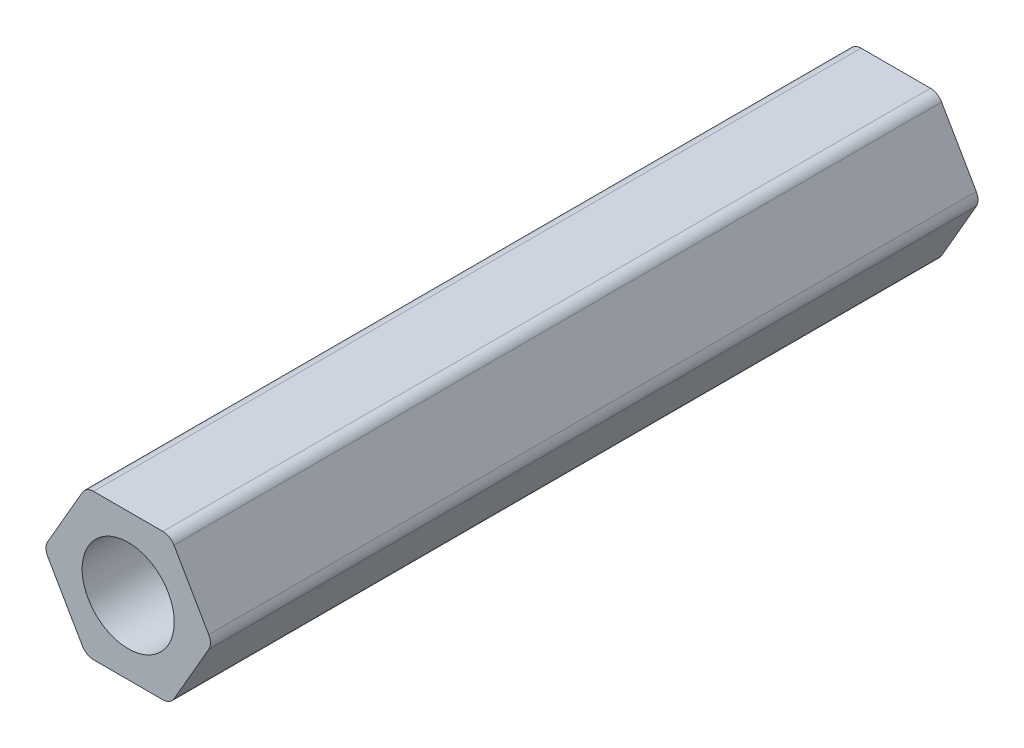
ISO-10303-21;
HEADER;
FILE_DESCRIPTION(('STEP AP214'),'2;1');
FILE_NAME('part.step','',(''),(''),'','','');
FILE_SCHEMA(('AUTOMOTIVE_DESIGN { 1 0 10303 214 1 1 1 1 }'));
ENDSEC;
DATA;
#1=APPLICATION_CONTEXT('core data for automotive mechanical design processes');
#2=APPLICATION_PROTOCOL_DEFINITION('international standard','automotive_design',2000,#1);
#3=PRODUCT_CONTEXT('',#1,'mechanical');
#4=PRODUCT('Part','Part','',(#3));
#5=PRODUCT_RELATED_PRODUCT_CATEGORY('part','',(#4));
#6=PRODUCT_DEFINITION_FORMATION('','',#4);
#7=PRODUCT_DEFINITION_CONTEXT('part definition',#1,'design');
#8=PRODUCT_DEFINITION('design','',#6,#7);
#9=PRODUCT_DEFINITION_SHAPE('','',#8);
#10=(LENGTH_UNIT() NAMED_UNIT(*) SI_UNIT(.MILLI.,.METRE.));
#11=(NAMED_UNIT(*) PLANE_ANGLE_UNIT() SI_UNIT($,.RADIAN.));
#12=(NAMED_UNIT(*) SI_UNIT($,.STERADIAN.) SOLID_ANGLE_UNIT());
#13=UNCERTAINTY_MEASURE_WITH_UNIT(LENGTH_MEASURE(1.E-05),#10,'distance_accuracy_value','');
#14=(GEOMETRIC_REPRESENTATION_CONTEXT(3) GLOBAL_UNCERTAINTY_ASSIGNED_CONTEXT((#13)) GLOBAL_UNIT_ASSIGNED_CONTEXT((#10,
#11,#12)) REPRESENTATION_CONTEXT('',''));
#15=CARTESIAN_POINT('',(0.,0.,0.));
#16=DIRECTION('',(0.,0.,1.));
#17=DIRECTION('',(1.,0.,0.));
#18=AXIS2_PLACEMENT_3D('',#15,#16,#17);
#19=CARTESIAN_POINT('',(-1.35677313259562,-2.35,15.));
#20=DIRECTION('',(0.,0.,1.));
#21=DIRECTION('',(1.,0.,0.));
#22=AXIS2_PLACEMENT_3D('',#19,#20,#21);
#23=CYLINDRICAL_SURFACE('',#22,0.5);
#24=CARTESIAN_POINT('',(-1.35677313259562,-2.35,-15.));
#25=DIRECTION('',(0.,0.,1.));
#26=DIRECTION('',(1.,0.,0.));
#27=AXIS2_PLACEMENT_3D('',#24,#25,#26);
#28=CIRCLE('',#27,0.5);
#29=CARTESIAN_POINT('',(-1.78978583448784,-2.6,-15.));
#30=VERTEX_POINT('',#29);
#31=CARTESIAN_POINT('',(-1.35677313259562,-2.85,-15.));
#32=VERTEX_POINT('',#31);
#33=EDGE_CURVE('E112',#30,#32,#28,.T.);
#34=ORIENTED_EDGE('',*,*,#33,.T.);
#35=DIRECTION('',(0.,0.,1.));
#36=VECTOR('',#35,1.);
#37=CARTESIAN_POINT('',(-1.35677313259562,-2.85,15.));
#38=LINE('',#37,#36);
#39=CARTESIAN_POINT('',(-1.35677313259562,-2.85,15.));
#40=VERTEX_POINT('',#39);
#41=EDGE_CURVE('E110',#32,#40,#38,.T.);
#42=ORIENTED_EDGE('',*,*,#41,.T.);
#43=CARTESIAN_POINT('',(-1.35677313259562,-2.35,15.));
#44=DIRECTION('',(0.,0.,1.));
#45=DIRECTION('',(1.,0.,0.));
#46=AXIS2_PLACEMENT_3D('',#43,#44,#45);
#47=CIRCLE('',#46,0.5);
#48=CARTESIAN_POINT('',(-1.78978583448784,-2.6,15.));
#49=VERTEX_POINT('',#48);
#50=EDGE_CURVE('E19',#40,#49,#47,.F.);
#51=ORIENTED_EDGE('',*,*,#50,.T.);
#52=DIRECTION('',(0.,0.,1.));
#53=VECTOR('',#52,1.);
#54=CARTESIAN_POINT('',(-1.78978583448784,-2.59999999999999,15.));
#55=LINE('',#54,#53);
#56=EDGE_CURVE('E107',#49,#30,#55,.F.);
#57=ORIENTED_EDGE('',*,*,#56,.T.);
#58=EDGE_LOOP('',(#34,#42,#51,#57));
#59=FACE_BOUND('',#58,.T.);
#60=ADVANCED_FACE('F16',(#59),#23,.T.);
#61=CARTESIAN_POINT('',(1.35677313259562,-2.35,15.));
#62=DIRECTION('',(0.,0.,1.));
#63=DIRECTION('',(1.,0.,0.));
#64=AXIS2_PLACEMENT_3D('',#61,#62,#63);
#65=CYLINDRICAL_SURFACE('',#64,0.5);
#66=CARTESIAN_POINT('',(1.35677313259562,-2.35,-15.));
#67=DIRECTION('',(0.,0.,1.));
#68=DIRECTION('',(1.,0.,0.));
#69=AXIS2_PLACEMENT_3D('',#66,#67,#68);
#70=CIRCLE('',#69,0.5);
#71=CARTESIAN_POINT('',(1.35677313259562,-2.85,-15.));
#72=VERTEX_POINT('',#71);
#73=CARTESIAN_POINT('',(1.78978583448784,-2.6,-15.));
#74=VERTEX_POINT('',#73);
#75=EDGE_CURVE('E183',#72,#74,#70,.T.);
#76=ORIENTED_EDGE('',*,*,#75,.T.);
#77=DIRECTION('',(0.,0.,1.));
#78=VECTOR('',#77,1.);
#79=CARTESIAN_POINT('',(1.78978583448784,-2.59999999999999,15.));
#80=LINE('',#79,#78);
#81=CARTESIAN_POINT('',(1.78978583448784,-2.6,15.));
#82=VERTEX_POINT('',#81);
#83=EDGE_CURVE('E155',#74,#82,#80,.T.);
#84=ORIENTED_EDGE('',*,*,#83,.T.);
#85=CARTESIAN_POINT('',(1.35677313259562,-2.35,15.));
#86=DIRECTION('',(0.,0.,1.));
#87=DIRECTION('',(1.,0.,0.));
#88=AXIS2_PLACEMENT_3D('',#85,#86,#87);
#89=CIRCLE('',#88,0.5);
#90=CARTESIAN_POINT('',(1.35677313259562,-2.85,15.));
#91=VERTEX_POINT('',#90);
#92=EDGE_CURVE('E185',#82,#91,#89,.F.);
#93=ORIENTED_EDGE('',*,*,#92,.T.);
#94=DIRECTION('',(0.,0.,1.));
#95=VECTOR('',#94,1.);
#96=CARTESIAN_POINT('',(1.35677313259562,-2.85,15.));
#97=LINE('',#96,#95);
#98=EDGE_CURVE('E162',#91,#72,#97,.F.);
#99=ORIENTED_EDGE('',*,*,#98,.T.);
#100=EDGE_LOOP('',(#76,#84,#93,#99));
#101=FACE_BOUND('',#100,.T.);
#102=ADVANCED_FACE('F354',(#101),#65,.T.);
#103=CARTESIAN_POINT('',(2.71354626519125,0.,15.));
#104=DIRECTION('',(0.,0.,1.));
#105=DIRECTION('',(1.,0.,0.));
#106=AXIS2_PLACEMENT_3D('',#103,#104,#105);
#107=CYLINDRICAL_SURFACE('',#106,0.5);
#108=CARTESIAN_POINT('',(2.71354626519125,0.,-15.));
#109=DIRECTION('',(0.,0.,1.));
#110=DIRECTION('',(1.,0.,0.));
#111=AXIS2_PLACEMENT_3D('',#108,#109,#110);
#112=CIRCLE('',#111,0.5);
#113=CARTESIAN_POINT('',(3.14655896708347,-0.249999999999989,-15.));
#114=VERTEX_POINT('',#113);
#115=CARTESIAN_POINT('',(3.14655896708347,0.25000000000001,-15.));
#116=VERTEX_POINT('',#115);
#117=EDGE_CURVE('E179',#114,#116,#112,.T.);
#118=ORIENTED_EDGE('',*,*,#117,.T.);
#119=DIRECTION('',(0.,0.,1.));
#120=VECTOR('',#119,1.);
#121=CARTESIAN_POINT('',(3.14655896708346,0.250000000000008,15.));
#122=LINE('',#121,#120);
#123=CARTESIAN_POINT('',(3.14655896708347,0.25000000000001,15.));
#124=VERTEX_POINT('',#123);
#125=EDGE_CURVE('E148',#116,#124,#122,.T.);
#126=ORIENTED_EDGE('',*,*,#125,.T.);
#127=CARTESIAN_POINT('',(2.71354626519125,0.,15.));
#128=DIRECTION('',(0.,0.,1.));
#129=DIRECTION('',(1.,0.,0.));
#130=AXIS2_PLACEMENT_3D('',#127,#128,#129);
#131=CIRCLE('',#130,0.5);
#132=CARTESIAN_POINT('',(3.14655896708347,-0.249999999999989,15.));
#133=VERTEX_POINT('',#132);
#134=EDGE_CURVE('E181',#124,#133,#131,.F.);
#135=ORIENTED_EDGE('',*,*,#134,.T.);
#136=DIRECTION('',(0.,0.,1.));
#137=VECTOR('',#136,1.);
#138=CARTESIAN_POINT('',(3.14655896708347,-0.249999999999988,15.));
#139=LINE('',#138,#137);
#140=EDGE_CURVE('E158',#133,#114,#139,.F.);
#141=ORIENTED_EDGE('',*,*,#140,.T.);
#142=EDGE_LOOP('',(#118,#126,#135,#141));
#143=FACE_BOUND('',#142,.T.);
#144=ADVANCED_FACE('F212',(#143),#107,.T.);
#145=CARTESIAN_POINT('',(1.35677313259562,2.35,15.));
#146=DIRECTION('',(0.,0.,1.));
#147=DIRECTION('',(1.,0.,0.));
#148=AXIS2_PLACEMENT_3D('',#145,#146,#147);
#149=CYLINDRICAL_SURFACE('',#148,0.5);
#150=CARTESIAN_POINT('',(1.35677313259562,2.35,-15.));
#151=DIRECTION('',(0.,0.,1.));
#152=DIRECTION('',(1.,0.,0.));
#153=AXIS2_PLACEMENT_3D('',#150,#151,#152);
#154=CIRCLE('',#153,0.5);
#155=CARTESIAN_POINT('',(1.78978583448785,2.6,-15.));
#156=VERTEX_POINT('',#155);
#157=CARTESIAN_POINT('',(1.35677313259562,2.85,-15.));
#158=VERTEX_POINT('',#157);
#159=EDGE_CURVE('E175',#156,#158,#154,.T.);
#160=ORIENTED_EDGE('',*,*,#159,.T.);
#161=DIRECTION('',(0.,0.,1.));
#162=VECTOR('',#161,1.);
#163=CARTESIAN_POINT('',(1.35677313259562,2.85,15.));
#164=LINE('',#163,#162);
#165=CARTESIAN_POINT('',(1.35677313259562,2.85,15.));
#166=VERTEX_POINT('',#165);
#167=EDGE_CURVE('E145',#158,#166,#164,.T.);
#168=ORIENTED_EDGE('',*,*,#167,.T.);
#169=CARTESIAN_POINT('',(1.35677313259562,2.35,15.));
#170=DIRECTION('',(0.,0.,1.));
#171=DIRECTION('',(1.,0.,0.));
#172=AXIS2_PLACEMENT_3D('',#169,#170,#171);
#173=CIRCLE('',#172,0.5);
#174=CARTESIAN_POINT('',(1.78978583448785,2.6,15.));
#175=VERTEX_POINT('',#174);
#176=EDGE_CURVE('E177',#166,#175,#173,.F.);
#177=ORIENTED_EDGE('',*,*,#176,.T.);
#178=DIRECTION('',(0.,0.,1.));
#179=VECTOR('',#178,1.);
#180=CARTESIAN_POINT('',(1.78978583448785,2.6,15.));
#181=LINE('',#180,#179);
#182=EDGE_CURVE('E152',#175,#156,#181,.F.);
#183=ORIENTED_EDGE('',*,*,#182,.T.);
#184=EDGE_LOOP('',(#160,#168,#177,#183));
#185=FACE_BOUND('',#184,.T.);
#186=ADVANCED_FACE('F223',(#185),#149,.T.);
#187=CARTESIAN_POINT('',(-2.71354626519125,0.,15.));
#188=DIRECTION('',(0.,0.,1.));
#189=DIRECTION('',(1.,0.,0.));
#190=AXIS2_PLACEMENT_3D('',#187,#188,#189);
#191=CYLINDRICAL_SURFACE('',#190,0.5);
#192=CARTESIAN_POINT('',(-2.71354626519125,0.,-15.));
#193=DIRECTION('',(0.,0.,1.));
#194=DIRECTION('',(1.,0.,0.));
#195=AXIS2_PLACEMENT_3D('',#192,#193,#194);
#196=CIRCLE('',#195,0.5);
#197=CARTESIAN_POINT('',(-3.14655896708346,0.250000000000007,-15.));
#198=VERTEX_POINT('',#197);
#199=CARTESIAN_POINT('',(-3.14655896708347,-0.249999999999989,-15.));
#200=VERTEX_POINT('',#199);
#201=EDGE_CURVE('E172',#198,#200,#196,.T.);
#202=ORIENTED_EDGE('',*,*,#201,.T.);
#203=DIRECTION('',(0.,0.,1.));
#204=VECTOR('',#203,1.);
#205=CARTESIAN_POINT('',(-3.14655896708346,-0.249999999999988,15.));
#206=LINE('',#205,#204);
#207=CARTESIAN_POINT('',(-3.14655896708347,-0.249999999999989,15.));
#208=VERTEX_POINT('',#207);
#209=EDGE_CURVE('E120',#200,#208,#206,.T.);
#210=ORIENTED_EDGE('',*,*,#209,.T.);
#211=CARTESIAN_POINT('',(-2.71354626519125,0.,15.));
#212=DIRECTION('',(0.,0.,1.));
#213=DIRECTION('',(1.,0.,0.));
#214=AXIS2_PLACEMENT_3D('',#211,#212,#213);
#215=CIRCLE('',#214,0.5);
#216=CARTESIAN_POINT('',(-3.14655896708346,0.250000000000007,15.));
#217=VERTEX_POINT('',#216);
#218=EDGE_CURVE('E126',#208,#217,#215,.F.);
#219=ORIENTED_EDGE('',*,*,#218,.T.);
#220=DIRECTION('',(0.,0.,1.));
#221=VECTOR('',#220,1.);
#222=CARTESIAN_POINT('',(-3.14655896708346,0.250000000000003,15.));
#223=LINE('',#222,#221);
#224=EDGE_CURVE('E141',#217,#198,#223,.F.);
#225=ORIENTED_EDGE('',*,*,#224,.T.);
#226=EDGE_LOOP('',(#202,#210,#219,#225));
#227=FACE_BOUND('',#226,.T.);
#228=ADVANCED_FACE('F238',(#227),#191,.T.);
#229=CARTESIAN_POINT('',(-1.35677313259562,2.35,15.));
#230=DIRECTION('',(0.,0.,1.));
#231=DIRECTION('',(1.,0.,0.));
#232=AXIS2_PLACEMENT_3D('',#229,#230,#231);
#233=CYLINDRICAL_SURFACE('',#232,0.5);
#234=CARTESIAN_POINT('',(-1.35677313259562,2.35,-15.));
#235=DIRECTION('',(0.,0.,1.));
#236=DIRECTION('',(1.,0.,0.));
#237=AXIS2_PLACEMENT_3D('',#234,#235,#236);
#238=CIRCLE('',#237,0.5);
#239=CARTESIAN_POINT('',(-1.35677313259562,2.85,-15.));
#240=VERTEX_POINT('',#239);
#241=CARTESIAN_POINT('',(-1.78978583448784,2.6,-15.));
#242=VERTEX_POINT('',#241);
#243=EDGE_CURVE('E34',#240,#242,#238,.T.);
#244=ORIENTED_EDGE('',*,*,#243,.T.);
#245=DIRECTION('',(0.,0.,1.));
#246=VECTOR('',#245,1.);
#247=CARTESIAN_POINT('',(-1.78978583448784,2.59999999999999,15.));
#248=LINE('',#247,#246);
#249=CARTESIAN_POINT('',(-1.78978583448784,2.6,15.));
#250=VERTEX_POINT('',#249);
#251=EDGE_CURVE('E139',#242,#250,#248,.T.);
#252=ORIENTED_EDGE('',*,*,#251,.T.);
#253=CARTESIAN_POINT('',(-1.35677313259562,2.35,15.));
#254=DIRECTION('',(0.,0.,1.));
#255=DIRECTION('',(1.,0.,0.));
#256=AXIS2_PLACEMENT_3D('',#253,#254,#255);
#257=CIRCLE('',#256,0.5);
#258=CARTESIAN_POINT('',(-1.35677313259562,2.85,15.));
#259=VERTEX_POINT('',#258);
#260=EDGE_CURVE('E170',#250,#259,#257,.F.);
#261=ORIENTED_EDGE('',*,*,#260,.T.);
#262=DIRECTION('',(0.,0.,1.));
#263=VECTOR('',#262,1.);
#264=CARTESIAN_POINT('',(-1.35677313259562,2.85,15.));
#265=LINE('',#264,#263);
#266=EDGE_CURVE('E144',#259,#240,#265,.F.);
#267=ORIENTED_EDGE('',*,*,#266,.T.);
#268=EDGE_LOOP('',(#244,#252,#261,#267));
#269=FACE_BOUND('',#268,.T.);
#270=ADVANCED_FACE('F230',(#269),#233,.T.);
#271=CARTESIAN_POINT('',(-3.29089653438087,0.,15.));
#272=DIRECTION('',(0.866025403784438,0.5,0.));
#273=DIRECTION('',(-0.5,0.866025403784438,0.));
#274=AXIS2_PLACEMENT_3D('',#271,#272,#273);
#275=PLANE('',#274);
#276=ORIENTED_EDGE('',*,*,#209,.F.);
#277=DIRECTION('',(0.499999999999998,-0.866025403784439,0.));
#278=VECTOR('',#277,1.);
#279=CARTESIAN_POINT('',(-3.14655896708347,-0.249999999999991,-15.));
#280=LINE('',#279,#278);
#281=EDGE_CURVE('E119',#200,#30,#280,.T.);
#282=ORIENTED_EDGE('',*,*,#281,.T.);
#283=ORIENTED_EDGE('',*,*,#56,.F.);
#284=DIRECTION('',(0.499999999999998,-0.866025403784439,0.));
#285=VECTOR('',#284,1.);
#286=CARTESIAN_POINT('',(-3.14655896708347,-0.249999999999991,15.));
#287=LINE('',#286,#285);
#288=EDGE_CURVE('E117',#208,#49,#287,.T.);
#289=ORIENTED_EDGE('',*,*,#288,.F.);
#290=EDGE_LOOP('',(#276,#282,#283,#289));
#291=FACE_BOUND('',#290,.T.);
#292=ADVANCED_FACE('F116',(#291),#275,.F.);
#293=CARTESIAN_POINT('',(-1.64544826719043,-2.85,15.));
#294=DIRECTION('',(0.,1.,0.));
#295=DIRECTION('',(-1.,0.,0.));
#296=AXIS2_PLACEMENT_3D('',#293,#294,#295);
#297=PLANE('',#296);
#298=ORIENTED_EDGE('',*,*,#41,.F.);
#299=DIRECTION('',(1.,0.,0.));
#300=VECTOR('',#299,1.);
#301=CARTESIAN_POINT('',(0.,-2.85,-15.));
#302=LINE('',#301,#300);
#303=EDGE_CURVE('E192',#32,#72,#302,.T.);
#304=ORIENTED_EDGE('',*,*,#303,.T.);
#305=ORIENTED_EDGE('',*,*,#98,.F.);
#306=DIRECTION('',(1.,0.,0.));
#307=VECTOR('',#306,1.);
#308=CARTESIAN_POINT('',(0.,-2.85,15.));
#309=LINE('',#308,#307);
#310=EDGE_CURVE('E128',#40,#91,#309,.T.);
#311=ORIENTED_EDGE('',*,*,#310,.F.);
#312=EDGE_LOOP('',(#298,#304,#305,#311));
#313=FACE_BOUND('',#312,.T.);
#314=ADVANCED_FACE('F190',(#313),#297,.F.);
#315=CARTESIAN_POINT('',(1.64544826719043,-2.85,15.));
#316=DIRECTION('',(-0.866025403784438,0.5,0.));
#317=DIRECTION('',(-0.5,-0.866025403784438,0.));
#318=AXIS2_PLACEMENT_3D('',#315,#316,#317);
#319=PLANE('',#318);
#320=ORIENTED_EDGE('',*,*,#83,.F.);
#321=DIRECTION('',(0.499999999999998,0.86602540378444,0.));
#322=VECTOR('',#321,1.);
#323=CARTESIAN_POINT('',(1.78978583448785,-2.6,-15.));
#324=LINE('',#323,#322);
#325=EDGE_CURVE('E196',#74,#114,#324,.T.);
#326=ORIENTED_EDGE('',*,*,#325,.T.);
#327=ORIENTED_EDGE('',*,*,#140,.F.);
#328=DIRECTION('',(0.499999999999998,0.86602540378444,0.));
#329=VECTOR('',#328,1.);
#330=CARTESIAN_POINT('',(1.78978583448785,-2.6,15.));
#331=LINE('',#330,#329);
#332=EDGE_CURVE('E131',#82,#133,#331,.T.);
#333=ORIENTED_EDGE('',*,*,#332,.F.);
#334=EDGE_LOOP('',(#320,#326,#327,#333));
#335=FACE_BOUND('',#334,.T.);
#336=ADVANCED_FACE('F210',(#335),#319,.F.);
#337=CARTESIAN_POINT('',(3.29089653438087,0.,15.));
#338=DIRECTION('',(-0.866025403784438,-0.5,0.));
#339=DIRECTION('',(0.5,-0.866025403784438,0.));
#340=AXIS2_PLACEMENT_3D('',#337,#338,#339);
#341=PLANE('',#340);
#342=ORIENTED_EDGE('',*,*,#125,.F.);
#343=DIRECTION('',(-0.500000000000002,0.866025403784438,0.));
#344=VECTOR('',#343,1.);
#345=CARTESIAN_POINT('',(3.14655896708347,0.250000000000011,-15.));
#346=LINE('',#345,#344);
#347=EDGE_CURVE('E199',#116,#156,#346,.T.);
#348=ORIENTED_EDGE('',*,*,#347,.T.);
#349=ORIENTED_EDGE('',*,*,#182,.F.);
#350=DIRECTION('',(-0.500000000000002,0.866025403784438,0.));
#351=VECTOR('',#350,1.);
#352=CARTESIAN_POINT('',(3.14655896708347,0.250000000000011,15.));
#353=LINE('',#352,#351);
#354=EDGE_CURVE('E201',#124,#175,#353,.T.);
#355=ORIENTED_EDGE('',*,*,#354,.F.);
#356=EDGE_LOOP('',(#342,#348,#349,#355));
#357=FACE_BOUND('',#356,.T.);
#358=ADVANCED_FACE('F219',(#357),#341,.F.);
#359=CARTESIAN_POINT('',(1.64544826719043,2.85,15.));
#360=DIRECTION('',(0.,-1.,0.));
#361=DIRECTION('',(1.,0.,0.));
#362=AXIS2_PLACEMENT_3D('',#359,#360,#361);
#363=PLANE('',#362);
#364=ORIENTED_EDGE('',*,*,#266,.F.);
#365=DIRECTION('',(1.,0.,0.));
#366=VECTOR('',#365,1.);
#367=CARTESIAN_POINT('',(0.,2.85,15.));
#368=LINE('',#367,#366);
#369=EDGE_CURVE('E133',#166,#259,#368,.F.);
#370=ORIENTED_EDGE('',*,*,#369,.F.);
#371=ORIENTED_EDGE('',*,*,#167,.F.);
#372=DIRECTION('',(1.,0.,0.));
#373=VECTOR('',#372,1.);
#374=CARTESIAN_POINT('',(0.,2.85,-15.));
#375=LINE('',#374,#373);
#376=EDGE_CURVE('E229',#158,#240,#375,.F.);
#377=ORIENTED_EDGE('',*,*,#376,.T.);
#378=EDGE_LOOP('',(#364,#370,#371,#377));
#379=FACE_BOUND('',#378,.T.);
#380=ADVANCED_FACE('F228',(#379),#363,.F.);
#381=CARTESIAN_POINT('',(-1.64544826719043,2.85,15.));
#382=DIRECTION('',(0.866025403784438,-0.5,0.));
#383=DIRECTION('',(0.5,0.866025403784438,0.));
#384=AXIS2_PLACEMENT_3D('',#381,#382,#383);
#385=PLANE('',#384);
#386=ORIENTED_EDGE('',*,*,#251,.F.);
#387=DIRECTION('',(-0.500000000000002,-0.866025403784438,0.));
#388=VECTOR('',#387,1.);
#389=CARTESIAN_POINT('',(-1.78978583448785,2.6,-15.));
#390=LINE('',#389,#388);
#391=EDGE_CURVE('E168',#242,#198,#390,.T.);
#392=ORIENTED_EDGE('',*,*,#391,.T.);
#393=ORIENTED_EDGE('',*,*,#224,.F.);
#394=DIRECTION('',(-0.500000000000002,-0.866025403784438,0.));
#395=VECTOR('',#394,1.);
#396=CARTESIAN_POINT('',(-1.78978583448785,2.6,15.));
#397=LINE('',#396,#395);
#398=EDGE_CURVE('E129',#250,#217,#397,.T.);
#399=ORIENTED_EDGE('',*,*,#398,.F.);
#400=EDGE_LOOP('',(#386,#392,#393,#399));
#401=FACE_BOUND('',#400,.T.);
#402=ADVANCED_FACE('F234',(#401),#385,.F.);
#403=CARTESIAN_POINT('',(0.,0.,15.));
#404=DIRECTION('',(0.,0.,1.));
#405=DIRECTION('',(1.,0.,0.));
#406=AXIS2_PLACEMENT_3D('',#403,#404,#405);
#407=PLANE('',#406);
#408=ORIENTED_EDGE('',*,*,#354,.T.);
#409=ORIENTED_EDGE('',*,*,#176,.F.);
#410=ORIENTED_EDGE('',*,*,#369,.T.);
#411=ORIENTED_EDGE('',*,*,#260,.F.);
#412=ORIENTED_EDGE('',*,*,#398,.T.);
#413=ORIENTED_EDGE('',*,*,#218,.F.);
#414=ORIENTED_EDGE('',*,*,#288,.T.);
#415=ORIENTED_EDGE('',*,*,#50,.F.);
#416=ORIENTED_EDGE('',*,*,#310,.T.);
#417=ORIENTED_EDGE('',*,*,#92,.F.);
#418=ORIENTED_EDGE('',*,*,#332,.T.);
#419=ORIENTED_EDGE('',*,*,#134,.F.);
#420=EDGE_LOOP('',(#408,#409,#410,#411,#412,#413,#414,#415,#416,#417,#418,#419));
#421=FACE_BOUND('',#420,.T.);
#422=CARTESIAN_POINT('',(0.,0.,15.));
#423=DIRECTION('',(0.,0.,1.));
#424=DIRECTION('',(1.,0.,0.));
#425=AXIS2_PLACEMENT_3D('',#422,#423,#424);
#426=CIRCLE('',#425,1.8);
#427=CARTESIAN_POINT('',(1.8,0.,15.));
#428=VERTEX_POINT('',#427);
#429=EDGE_CURVE('E25',#428,#428,#426,.F.);
#430=ORIENTED_EDGE('',*,*,#429,.T.);
#431=EDGE_LOOP('',(#430));
#432=FACE_BOUND('',#431,.T.);
#433=ADVANCED_FACE('F123',(#421,#432),#407,.T.);
#434=CARTESIAN_POINT('',(0.,0.,-15.));
#435=DIRECTION('',(0.,0.,1.));
#436=DIRECTION('',(1.,0.,0.));
#437=AXIS2_PLACEMENT_3D('',#434,#435,#436);
#438=PLANE('',#437);
#439=ORIENTED_EDGE('',*,*,#243,.F.);
#440=ORIENTED_EDGE('',*,*,#376,.F.);
#441=ORIENTED_EDGE('',*,*,#159,.F.);
#442=ORIENTED_EDGE('',*,*,#347,.F.);
#443=ORIENTED_EDGE('',*,*,#117,.F.);
#444=ORIENTED_EDGE('',*,*,#325,.F.);
#445=ORIENTED_EDGE('',*,*,#75,.F.);
#446=ORIENTED_EDGE('',*,*,#303,.F.);
#447=ORIENTED_EDGE('',*,*,#33,.F.);
#448=ORIENTED_EDGE('',*,*,#281,.F.);
#449=ORIENTED_EDGE('',*,*,#201,.F.);
#450=ORIENTED_EDGE('',*,*,#391,.F.);
#451=EDGE_LOOP('',(#439,#440,#441,#442,#443,#444,#445,#446,#447,#448,#449,#450));
#452=FACE_BOUND('',#451,.T.);
#453=CARTESIAN_POINT('',(0.,0.,-15.));
#454=DIRECTION('',(0.,0.,1.));
#455=DIRECTION('',(1.,0.,0.));
#456=AXIS2_PLACEMENT_3D('',#453,#454,#455);
#457=CIRCLE('',#456,1.8);
#458=CARTESIAN_POINT('',(1.8,0.,-15.));
#459=VERTEX_POINT('',#458);
#460=EDGE_CURVE('E11',#459,#459,#457,.T.);
#461=ORIENTED_EDGE('',*,*,#460,.T.);
#462=EDGE_LOOP('',(#461));
#463=FACE_BOUND('',#462,.T.);
#464=ADVANCED_FACE('F193',(#452,#463),#438,.F.);
#465=CARTESIAN_POINT('',(0.,0.,80.7067643680473));
#466=DIRECTION('',(0.,0.,1.));
#467=DIRECTION('',(1.,0.,0.));
#468=AXIS2_PLACEMENT_3D('',#465,#466,#467);
#469=CYLINDRICAL_SURFACE('',#468,1.8);
#470=ORIENTED_EDGE('',*,*,#460,.F.);
#471=EDGE_LOOP('',(#470));
#472=FACE_BOUND('',#471,.T.);
#473=ORIENTED_EDGE('',*,*,#429,.F.);
#474=EDGE_LOOP('',(#473));
#475=FACE_BOUND('',#474,.T.);
#476=ADVANCED_FACE('F250',(#472,#475),#469,.F.);
#477=CLOSED_SHELL('',(#60,#102,#144,#186,#228,#270,#292,#314,#336,#358,#380,#402,#433,#464,#476));
#478=MANIFOLD_SOLID_BREP('B1',#477);
#479=ADVANCED_BREP_SHAPE_REPRESENTATION('',(#18,#478),#14);
#480=SHAPE_DEFINITION_REPRESENTATION(#9,#479);
ENDSEC;
END-ISO-10303-21;
